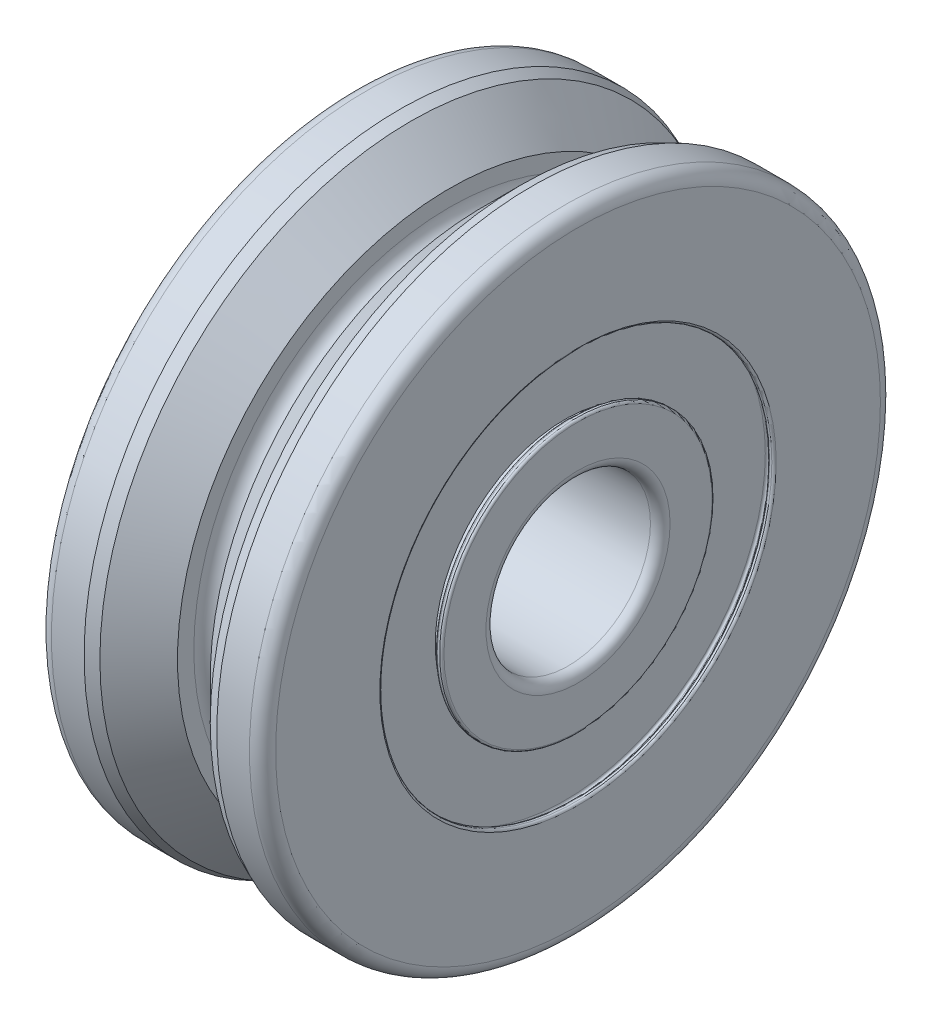
ISO-10303-21;
HEADER;
FILE_DESCRIPTION(('STEP AP214'),'2;1');
FILE_NAME('part.step','',(''),(''),'','','');
FILE_SCHEMA(('AUTOMOTIVE_DESIGN { 1 0 10303 214 1 1 1 1 }'));
ENDSEC;
DATA;
#1=APPLICATION_CONTEXT('core data for automotive mechanical design processes');
#2=APPLICATION_PROTOCOL_DEFINITION('international standard','automotive_design',2000,#1);
#3=PRODUCT_CONTEXT('',#1,'mechanical');
#4=PRODUCT('Part','Part','',(#3));
#5=PRODUCT_RELATED_PRODUCT_CATEGORY('part','',(#4));
#6=PRODUCT_DEFINITION_FORMATION('','',#4);
#7=PRODUCT_DEFINITION_CONTEXT('part definition',#1,'design');
#8=PRODUCT_DEFINITION('design','',#6,#7);
#9=PRODUCT_DEFINITION_SHAPE('','',#8);
#10=(LENGTH_UNIT() NAMED_UNIT(*) SI_UNIT(.MILLI.,.METRE.));
#11=(NAMED_UNIT(*) PLANE_ANGLE_UNIT() SI_UNIT($,.RADIAN.));
#12=(NAMED_UNIT(*) SI_UNIT($,.STERADIAN.) SOLID_ANGLE_UNIT());
#13=UNCERTAINTY_MEASURE_WITH_UNIT(LENGTH_MEASURE(1.E-05),#10,'distance_accuracy_value','');
#14=(GEOMETRIC_REPRESENTATION_CONTEXT(3) GLOBAL_UNCERTAINTY_ASSIGNED_CONTEXT((#13)) GLOBAL_UNIT_ASSIGNED_CONTEXT((#10,
#11,#12)) REPRESENTATION_CONTEXT('',''));
#15=CARTESIAN_POINT('',(0.,0.,0.));
#16=DIRECTION('',(0.,0.,1.));
#17=DIRECTION('',(1.,0.,0.));
#18=AXIS2_PLACEMENT_3D('',#15,#16,#17);
#19=CARTESIAN_POINT('',(-3.41206666624328,0.,0.));
#20=DIRECTION('',(1.,0.,0.));
#21=DIRECTION('',(0.,0.,-1.));
#22=AXIS2_PLACEMENT_3D('',#19,#20,#21);
#23=TOROIDAL_SURFACE('',#22,4.16136666582,0.0677333337567227);
#24=CARTESIAN_POINT('',(-3.4798,0.,0.));
#25=DIRECTION('',(1.,0.,0.));
#26=DIRECTION('',(0.,0.,-1.));
#27=AXIS2_PLACEMENT_3D('',#24,#25,#26);
#28=CIRCLE('',#27,4.16136666582);
#29=CARTESIAN_POINT('',(-3.4798,0.,-4.16136666582));
#30=VERTEX_POINT('',#29);
#31=EDGE_CURVE('E10',#30,#30,#28,.T.);
#32=ORIENTED_EDGE('',*,*,#31,.T.);
#33=EDGE_LOOP('',(#32));
#34=FACE_BOUND('',#33,.T.);
#35=CARTESIAN_POINT('',(-3.41206666624328,0.,0.));
#36=DIRECTION('',(1.,0.,0.));
#37=DIRECTION('',(0.,0.,-1.));
#38=AXIS2_PLACEMENT_3D('',#35,#36,#37);
#39=CIRCLE('',#38,4.22909999957672);
#40=CARTESIAN_POINT('',(-3.41206666624328,0.,-4.22909999957672));
#41=VERTEX_POINT('',#40);
#42=EDGE_CURVE('E164',#41,#41,#39,.T.);
#43=ORIENTED_EDGE('',*,*,#42,.F.);
#44=EDGE_LOOP('',(#43));
#45=FACE_BOUND('',#44,.T.);
#46=ADVANCED_FACE('F34',(#34,#45),#23,.T.);
#47=CARTESIAN_POINT('',(-3.47980000000005,4.16136666582,0.));
#48=DIRECTION('',(-1.,0.,0.));
#49=DIRECTION('',(0.,0.,1.));
#50=AXIS2_PLACEMENT_3D('',#47,#48,#49);
#51=PLANE('',#50);
#52=CARTESIAN_POINT('',(-3.4798000000001,0.,0.));
#53=DIRECTION('',(1.,0.,0.));
#54=DIRECTION('',(0.,0.,-1.));
#55=AXIS2_PLACEMENT_3D('',#52,#53,#54);
#56=CIRCLE('',#55,2.8575);
#57=CARTESIAN_POINT('',(-3.4798000000001,0.,-2.8575));
#58=VERTEX_POINT('',#57);
#59=EDGE_CURVE('E40',#58,#58,#56,.T.);
#60=ORIENTED_EDGE('',*,*,#59,.T.);
#61=EDGE_LOOP('',(#60));
#62=FACE_BOUND('',#61,.T.);
#63=ORIENTED_EDGE('',*,*,#31,.F.);
#64=EDGE_LOOP('',(#63));
#65=FACE_BOUND('',#64,.T.);
#66=ADVANCED_FACE('F172',(#62,#65),#51,.T.);
#67=CARTESIAN_POINT('',(-3.17500000000013,0.,0.));
#68=DIRECTION('',(1.,0.,0.));
#69=DIRECTION('',(0.,0.,-1.));
#70=AXIS2_PLACEMENT_3D('',#67,#68,#69);
#71=TOROIDAL_SURFACE('',#70,2.8575,0.304799999999968);
#72=CARTESIAN_POINT('',(-3.175,0.,0.));
#73=DIRECTION('',(1.,0.,0.));
#74=DIRECTION('',(0.,0.,-1.));
#75=AXIS2_PLACEMENT_3D('',#72,#73,#74);
#76=CIRCLE('',#75,2.5527);
#77=CARTESIAN_POINT('',(-3.175,0.,-2.5527));
#78=VERTEX_POINT('',#77);
#79=EDGE_CURVE('E44',#78,#78,#76,.T.);
#80=ORIENTED_EDGE('',*,*,#79,.T.);
#81=EDGE_LOOP('',(#80));
#82=FACE_BOUND('',#81,.T.);
#83=ORIENTED_EDGE('',*,*,#59,.F.);
#84=EDGE_LOOP('',(#83));
#85=FACE_BOUND('',#84,.T.);
#86=ADVANCED_FACE('F176',(#82,#85),#71,.T.);
#87=CARTESIAN_POINT('',(-3.47980000084656,0.,0.));
#88=DIRECTION('',(1.,0.,0.));
#89=DIRECTION('',(0.,0.,-1.));
#90=AXIS2_PLACEMENT_3D('',#87,#88,#89);
#91=CYLINDRICAL_SURFACE('',#90,2.55270000000003);
#92=CARTESIAN_POINT('',(3.175,0.,0.));
#93=DIRECTION('',(1.,0.,0.));
#94=DIRECTION('',(0.,0.,-1.));
#95=AXIS2_PLACEMENT_3D('',#92,#93,#94);
#96=CIRCLE('',#95,2.55270000000006);
#97=CARTESIAN_POINT('',(3.175,0.,-2.55270000000006));
#98=VERTEX_POINT('',#97);
#99=EDGE_CURVE('E48',#98,#98,#96,.T.);
#100=ORIENTED_EDGE('',*,*,#99,.T.);
#101=EDGE_LOOP('',(#100));
#102=FACE_BOUND('',#101,.T.);
#103=ORIENTED_EDGE('',*,*,#79,.F.);
#104=EDGE_LOOP('',(#103));
#105=FACE_BOUND('',#104,.T.);
#106=ADVANCED_FACE('F180',(#102,#105),#91,.F.);
#107=CARTESIAN_POINT('',(3.17500000000013,0.,0.));
#108=DIRECTION('',(1.,0.,0.));
#109=DIRECTION('',(0.,0.,-1.));
#110=AXIS2_PLACEMENT_3D('',#107,#108,#109);
#111=TOROIDAL_SURFACE('',#110,2.8575,0.304799999999937);
#112=CARTESIAN_POINT('',(3.4798,0.,0.));
#113=DIRECTION('',(1.,0.,0.));
#114=DIRECTION('',(0.,0.,-1.));
#115=AXIS2_PLACEMENT_3D('',#112,#113,#114);
#116=CIRCLE('',#115,2.8575);
#117=CARTESIAN_POINT('',(3.4798,0.,-2.8575));
#118=VERTEX_POINT('',#117);
#119=EDGE_CURVE('E53',#118,#118,#116,.T.);
#120=ORIENTED_EDGE('',*,*,#119,.T.);
#121=EDGE_LOOP('',(#120));
#122=FACE_BOUND('',#121,.T.);
#123=ORIENTED_EDGE('',*,*,#99,.F.);
#124=EDGE_LOOP('',(#123));
#125=FACE_BOUND('',#124,.T.);
#126=ADVANCED_FACE('F187',(#122,#125),#111,.T.);
#127=CARTESIAN_POINT('',(3.47979999999998,2.8575,0.));
#128=DIRECTION('',(1.,0.,0.));
#129=DIRECTION('',(0.,0.,-1.));
#130=AXIS2_PLACEMENT_3D('',#127,#128,#129);
#131=PLANE('',#130);
#132=CARTESIAN_POINT('',(3.47979999999996,0.,0.));
#133=DIRECTION('',(1.,0.,0.));
#134=DIRECTION('',(0.,0.,-1.));
#135=AXIS2_PLACEMENT_3D('',#132,#133,#134);
#136=CIRCLE('',#135,4.16136666560836);
#137=CARTESIAN_POINT('',(3.47979999999996,0.,-4.16136666560836));
#138=VERTEX_POINT('',#137);
#139=EDGE_CURVE('E56',#138,#138,#136,.T.);
#140=ORIENTED_EDGE('',*,*,#139,.T.);
#141=EDGE_LOOP('',(#140));
#142=FACE_BOUND('',#141,.T.);
#143=ORIENTED_EDGE('',*,*,#119,.F.);
#144=EDGE_LOOP('',(#143));
#145=FACE_BOUND('',#144,.T.);
#146=ADVANCED_FACE('F191',(#142,#145),#131,.T.);
#147=CARTESIAN_POINT('',(3.4120666660316,0.,0.));
#148=DIRECTION('',(1.,0.,0.));
#149=DIRECTION('',(0.,0.,-1.));
#150=AXIS2_PLACEMENT_3D('',#147,#148,#149);
#151=TOROIDAL_SURFACE('',#150,4.16136666560836,0.0677333339683614);
#152=CARTESIAN_POINT('',(3.4120666660316,0.,0.));
#153=DIRECTION('',(1.,0.,0.));
#154=DIRECTION('',(0.,0.,-1.));
#155=AXIS2_PLACEMENT_3D('',#152,#153,#154);
#156=CIRCLE('',#155,4.22909999957672);
#157=CARTESIAN_POINT('',(3.4120666660316,0.,-4.22909999957672));
#158=VERTEX_POINT('',#157);
#159=EDGE_CURVE('E59',#158,#158,#156,.T.);
#160=ORIENTED_EDGE('',*,*,#159,.T.);
#161=EDGE_LOOP('',(#160));
#162=FACE_BOUND('',#161,.T.);
#163=ORIENTED_EDGE('',*,*,#139,.F.);
#164=EDGE_LOOP('',(#163));
#165=FACE_BOUND('',#164,.T.);
#166=ADVANCED_FACE('F195',(#162,#165),#151,.T.);
#167=CARTESIAN_POINT('',(-3.47980000084656,0.,0.));
#168=DIRECTION('',(1.,0.,0.));
#169=DIRECTION('',(0.,0.,-1.));
#170=AXIS2_PLACEMENT_3D('',#167,#168,#169);
#171=CYLINDRICAL_SURFACE('',#170,4.22909999957672);
#172=CARTESIAN_POINT('',(3.34433333375672,0.,0.));
#173=DIRECTION('',(1.,0.,0.));
#174=DIRECTION('',(0.,0.,-1.));
#175=AXIS2_PLACEMENT_3D('',#172,#173,#174);
#176=CIRCLE('',#175,4.22909999957672);
#177=CARTESIAN_POINT('',(3.34433333375672,0.,-4.22909999957672));
#178=VERTEX_POINT('',#177);
#179=EDGE_CURVE('E62',#178,#178,#176,.T.);
#180=ORIENTED_EDGE('',*,*,#179,.T.);
#181=EDGE_LOOP('',(#180));
#182=FACE_BOUND('',#181,.T.);
#183=ORIENTED_EDGE('',*,*,#159,.F.);
#184=EDGE_LOOP('',(#183));
#185=FACE_BOUND('',#184,.T.);
#186=ADVANCED_FACE('F199',(#182,#185),#171,.T.);
#187=CARTESIAN_POINT('',(3.34433333375672,0.,0.));
#188=DIRECTION('',(1.,0.,0.));
#189=DIRECTION('',(0.,0.,-1.));
#190=AXIS2_PLACEMENT_3D('',#187,#188,#189);
#191=TOROIDAL_SURFACE('',#190,4.16136666582,0.0677333337567223);
#192=CARTESIAN_POINT('',(3.2766,0.,0.));
#193=DIRECTION('',(1.,0.,0.));
#194=DIRECTION('',(0.,0.,-1.));
#195=AXIS2_PLACEMENT_3D('',#192,#193,#194);
#196=CIRCLE('',#195,4.16136666582);
#197=CARTESIAN_POINT('',(3.2766,0.,-4.16136666582));
#198=VERTEX_POINT('',#197);
#199=EDGE_CURVE('E65',#198,#198,#196,.T.);
#200=ORIENTED_EDGE('',*,*,#199,.T.);
#201=EDGE_LOOP('',(#200));
#202=FACE_BOUND('',#201,.T.);
#203=ORIENTED_EDGE('',*,*,#179,.F.);
#204=EDGE_LOOP('',(#203));
#205=FACE_BOUND('',#204,.T.);
#206=ADVANCED_FACE('F203',(#202,#205),#191,.T.);
#207=CARTESIAN_POINT('',(3.2766,4.16136666582,0.));
#208=DIRECTION('',(-1.,0.,0.));
#209=DIRECTION('',(0.,0.,1.));
#210=AXIS2_PLACEMENT_3D('',#207,#208,#209);
#211=PLANE('',#210);
#212=CARTESIAN_POINT('',(3.2766,0.,0.));
#213=DIRECTION('',(1.,0.,0.));
#214=DIRECTION('',(0.,0.,-1.));
#215=AXIS2_PLACEMENT_3D('',#212,#213,#214);
#216=CIRCLE('',#215,4.02589999978836);
#217=CARTESIAN_POINT('',(3.2766,0.,-4.02589999978836));
#218=VERTEX_POINT('',#217);
#219=EDGE_CURVE('E68',#218,#218,#216,.T.);
#220=ORIENTED_EDGE('',*,*,#219,.T.);
#221=EDGE_LOOP('',(#220));
#222=FACE_BOUND('',#221,.T.);
#223=ORIENTED_EDGE('',*,*,#199,.F.);
#224=EDGE_LOOP('',(#223));
#225=FACE_BOUND('',#224,.T.);
#226=ADVANCED_FACE('F207',(#222,#225),#211,.T.);
#227=CARTESIAN_POINT('',(-3.47980000084656,0.,0.));
#228=DIRECTION('',(1.,0.,0.));
#229=DIRECTION('',(0.,0.,-1.));
#230=AXIS2_PLACEMENT_3D('',#227,#228,#229);
#231=CYLINDRICAL_SURFACE('',#230,4.02589999978836);
#232=CARTESIAN_POINT('',(3.07340000042328,0.,0.));
#233=DIRECTION('',(1.,0.,0.));
#234=DIRECTION('',(0.,0.,-1.));
#235=AXIS2_PLACEMENT_3D('',#232,#233,#234);
#236=CIRCLE('',#235,4.02589999978836);
#237=CARTESIAN_POINT('',(3.07340000042328,0.,-4.02589999978836));
#238=VERTEX_POINT('',#237);
#239=EDGE_CURVE('E71',#238,#238,#236,.T.);
#240=ORIENTED_EDGE('',*,*,#239,.T.);
#241=EDGE_LOOP('',(#240));
#242=FACE_BOUND('',#241,.T.);
#243=ORIENTED_EDGE('',*,*,#219,.F.);
#244=EDGE_LOOP('',(#243));
#245=FACE_BOUND('',#244,.T.);
#246=ADVANCED_FACE('F211',(#242,#245),#231,.T.);
#247=CARTESIAN_POINT('',(3.07340000042328,4.02589999978836,0.));
#248=DIRECTION('',(1.,0.,0.));
#249=DIRECTION('',(0.,0.,-1.));
#250=AXIS2_PLACEMENT_3D('',#247,#248,#249);
#251=PLANE('',#250);
#252=CARTESIAN_POINT('',(3.07340000042328,0.,0.));
#253=DIRECTION('',(1.,0.,0.));
#254=DIRECTION('',(0.,0.,-1.));
#255=AXIS2_PLACEMENT_3D('',#252,#253,#254);
#256=CIRCLE('',#255,6.21876666582);
#257=CARTESIAN_POINT('',(3.07340000042328,0.,-6.21876666582));
#258=VERTEX_POINT('',#257);
#259=EDGE_CURVE('E74',#258,#258,#256,.T.);
#260=ORIENTED_EDGE('',*,*,#259,.T.);
#261=EDGE_LOOP('',(#260));
#262=FACE_BOUND('',#261,.T.);
#263=ORIENTED_EDGE('',*,*,#239,.F.);
#264=EDGE_LOOP('',(#263));
#265=FACE_BOUND('',#264,.T.);
#266=ADVANCED_FACE('F215',(#262,#265),#251,.T.);
#267=CARTESIAN_POINT('',(3.14113333439164,0.,0.));
#268=DIRECTION('',(1.,0.,0.));
#269=DIRECTION('',(0.,0.,-1.));
#270=AXIS2_PLACEMENT_3D('',#267,#268,#269);
#271=TOROIDAL_SURFACE('',#270,6.21876666582,0.0677333339683603);
#272=CARTESIAN_POINT('',(3.14113333439164,0.,0.));
#273=DIRECTION('',(1.,0.,0.));
#274=DIRECTION('',(0.,0.,-1.));
#275=AXIS2_PLACEMENT_3D('',#272,#273,#274);
#276=CIRCLE('',#275,6.28649999978836);
#277=CARTESIAN_POINT('',(3.14113333439164,0.,-6.28649999978836));
#278=VERTEX_POINT('',#277);
#279=EDGE_CURVE('E77',#278,#278,#276,.T.);
#280=ORIENTED_EDGE('',*,*,#279,.T.);
#281=EDGE_LOOP('',(#280));
#282=FACE_BOUND('',#281,.T.);
#283=ORIENTED_EDGE('',*,*,#259,.F.);
#284=EDGE_LOOP('',(#283));
#285=FACE_BOUND('',#284,.T.);
#286=ADVANCED_FACE('F219',(#282,#285),#271,.F.);
#287=CARTESIAN_POINT('',(-3.47980000084656,0.,0.));
#288=DIRECTION('',(1.,0.,0.));
#289=DIRECTION('',(0.,0.,-1.));
#290=AXIS2_PLACEMENT_3D('',#287,#288,#289);
#291=CYLINDRICAL_SURFACE('',#290,6.28649999978836);
#292=CARTESIAN_POINT('',(3.2766,0.,0.));
#293=DIRECTION('',(1.,0.,0.));
#294=DIRECTION('',(0.,0.,-1.));
#295=AXIS2_PLACEMENT_3D('',#292,#293,#294);
#296=CIRCLE('',#295,6.28649999978836);
#297=CARTESIAN_POINT('',(3.2766,0.,-6.28649999978836));
#298=VERTEX_POINT('',#297);
#299=EDGE_CURVE('E80',#298,#298,#296,.T.);
#300=ORIENTED_EDGE('',*,*,#299,.T.);
#301=EDGE_LOOP('',(#300));
#302=FACE_BOUND('',#301,.T.);
#303=ORIENTED_EDGE('',*,*,#279,.F.);
#304=EDGE_LOOP('',(#303));
#305=FACE_BOUND('',#304,.T.);
#306=ADVANCED_FACE('F223',(#302,#305),#291,.F.);
#307=CARTESIAN_POINT('',(3.2766,6.28649999978836,0.));
#308=DIRECTION('',(-1.,0.,0.));
#309=DIRECTION('',(0.,0.,1.));
#310=AXIS2_PLACEMENT_3D('',#307,#308,#309);
#311=PLANE('',#310);
#312=CARTESIAN_POINT('',(3.2766,0.,0.));
#313=DIRECTION('',(1.,0.,0.));
#314=DIRECTION('',(0.,0.,-1.));
#315=AXIS2_PLACEMENT_3D('',#312,#313,#314);
#316=CIRCLE('',#315,6.15103333418);
#317=CARTESIAN_POINT('',(3.2766,0.,-6.15103333418));
#318=VERTEX_POINT('',#317);
#319=EDGE_CURVE('E83',#318,#318,#316,.T.);
#320=ORIENTED_EDGE('',*,*,#319,.T.);
#321=EDGE_LOOP('',(#320));
#322=FACE_BOUND('',#321,.T.);
#323=ORIENTED_EDGE('',*,*,#299,.F.);
#324=EDGE_LOOP('',(#323));
#325=FACE_BOUND('',#324,.T.);
#326=ADVANCED_FACE('F227',(#322,#325),#311,.T.);
#327=CARTESIAN_POINT('',(3.34433333396836,0.,0.));
#328=DIRECTION('',(1.,0.,0.));
#329=DIRECTION('',(0.,0.,-1.));
#330=AXIS2_PLACEMENT_3D('',#327,#328,#329);
#331=TOROIDAL_SURFACE('',#330,6.15103333418,0.0677333339683614);
#332=CARTESIAN_POINT('',(3.34433333396836,0.,0.));
#333=DIRECTION('',(1.,0.,0.));
#334=DIRECTION('',(0.,0.,-1.));
#335=AXIS2_PLACEMENT_3D('',#332,#333,#334);
#336=CIRCLE('',#335,6.08330000021164);
#337=CARTESIAN_POINT('',(3.34433333396836,0.,-6.08330000021164));
#338=VERTEX_POINT('',#337);
#339=EDGE_CURVE('E86',#338,#338,#336,.T.);
#340=ORIENTED_EDGE('',*,*,#339,.T.);
#341=EDGE_LOOP('',(#340));
#342=FACE_BOUND('',#341,.T.);
#343=ORIENTED_EDGE('',*,*,#319,.F.);
#344=EDGE_LOOP('',(#343));
#345=FACE_BOUND('',#344,.T.);
#346=ADVANCED_FACE('F231',(#342,#345),#331,.T.);
#347=CARTESIAN_POINT('',(-3.47980000084656,0.,0.));
#348=DIRECTION('',(1.,0.,0.));
#349=DIRECTION('',(0.,0.,-1.));
#350=AXIS2_PLACEMENT_3D('',#347,#348,#349);
#351=CYLINDRICAL_SURFACE('',#350,6.08330000021164);
#352=CARTESIAN_POINT('',(3.41206666624324,0.,0.));
#353=DIRECTION('',(1.,0.,0.));
#354=DIRECTION('',(0.,0.,-1.));
#355=AXIS2_PLACEMENT_3D('',#352,#353,#354);
#356=CIRCLE('',#355,6.08330000021164);
#357=CARTESIAN_POINT('',(3.41206666624324,0.,-6.08330000021164));
#358=VERTEX_POINT('',#357);
#359=EDGE_CURVE('E89',#358,#358,#356,.T.);
#360=ORIENTED_EDGE('',*,*,#359,.T.);
#361=EDGE_LOOP('',(#360));
#362=FACE_BOUND('',#361,.T.);
#363=ORIENTED_EDGE('',*,*,#339,.F.);
#364=EDGE_LOOP('',(#363));
#365=FACE_BOUND('',#364,.T.);
#366=ADVANCED_FACE('F235',(#362,#365),#351,.F.);
#367=CARTESIAN_POINT('',(3.41206666624324,0.,0.));
#368=DIRECTION('',(1.,0.,0.));
#369=DIRECTION('',(0.,0.,-1.));
#370=AXIS2_PLACEMENT_3D('',#367,#368,#369);
#371=TOROIDAL_SURFACE('',#370,6.15103333396836,0.0677333337567212);
#372=CARTESIAN_POINT('',(3.47979999999996,0.,0.));
#373=DIRECTION('',(1.,0.,0.));
#374=DIRECTION('',(0.,0.,-1.));
#375=AXIS2_PLACEMENT_3D('',#372,#373,#374);
#376=CIRCLE('',#375,6.15103333396836);
#377=CARTESIAN_POINT('',(3.47979999999996,0.,-6.15103333396836));
#378=VERTEX_POINT('',#377);
#379=EDGE_CURVE('E92',#378,#378,#376,.T.);
#380=ORIENTED_EDGE('',*,*,#379,.T.);
#381=EDGE_LOOP('',(#380));
#382=FACE_BOUND('',#381,.T.);
#383=ORIENTED_EDGE('',*,*,#359,.F.);
#384=EDGE_LOOP('',(#383));
#385=FACE_BOUND('',#384,.T.);
#386=ADVANCED_FACE('F239',(#382,#385),#371,.T.);
#387=CARTESIAN_POINT('',(3.47979999999996,6.15103333396836,0.));
#388=DIRECTION('',(1.,0.,0.));
#389=DIRECTION('',(0.,0.,-1.));
#390=AXIS2_PLACEMENT_3D('',#387,#388,#389);
#391=PLANE('',#390);
#392=CARTESIAN_POINT('',(3.47979999999996,0.,0.));
#393=DIRECTION('',(1.,0.,0.));
#394=DIRECTION('',(0.,0.,-1.));
#395=AXIS2_PLACEMENT_3D('',#392,#393,#394);
#396=CIRCLE('',#395,9.3853);
#397=CARTESIAN_POINT('',(3.47979999999996,0.,-9.3853));
#398=VERTEX_POINT('',#397);
#399=EDGE_CURVE('E95',#398,#398,#396,.T.);
#400=ORIENTED_EDGE('',*,*,#399,.T.);
#401=EDGE_LOOP('',(#400));
#402=FACE_BOUND('',#401,.T.);
#403=ORIENTED_EDGE('',*,*,#379,.F.);
#404=EDGE_LOOP('',(#403));
#405=FACE_BOUND('',#404,.T.);
#406=ADVANCED_FACE('F243',(#402,#405),#391,.T.);
#407=CARTESIAN_POINT('',(3.07339999999995,0.,0.));
#408=DIRECTION('',(1.,0.,0.));
#409=DIRECTION('',(0.,0.,-1.));
#410=AXIS2_PLACEMENT_3D('',#407,#408,#409);
#411=TOROIDAL_SURFACE('',#410,9.3853,0.406400000000013);
#412=CARTESIAN_POINT('',(3.0734,0.,0.));
#413=DIRECTION('',(1.,0.,0.));
#414=DIRECTION('',(0.,0.,-1.));
#415=AXIS2_PLACEMENT_3D('',#412,#413,#414);
#416=CIRCLE('',#415,9.7917);
#417=CARTESIAN_POINT('',(3.0734,0.,-9.7917));
#418=VERTEX_POINT('',#417);
#419=EDGE_CURVE('E98',#418,#418,#416,.T.);
#420=ORIENTED_EDGE('',*,*,#419,.T.);
#421=EDGE_LOOP('',(#420));
#422=FACE_BOUND('',#421,.T.);
#423=ORIENTED_EDGE('',*,*,#399,.F.);
#424=EDGE_LOOP('',(#423));
#425=FACE_BOUND('',#424,.T.);
#426=ADVANCED_FACE('F247',(#422,#425),#411,.T.);
#427=CARTESIAN_POINT('',(-3.47980000084656,0.,0.));
#428=DIRECTION('',(1.,0.,0.));
#429=DIRECTION('',(0.,0.,-1.));
#430=AXIS2_PLACEMENT_3D('',#427,#428,#429);
#431=CYLINDRICAL_SURFACE('',#430,9.7917);
#432=CARTESIAN_POINT('',(2.0593460483126,0.,0.));
#433=DIRECTION('',(1.,0.,0.));
#434=DIRECTION('',(0.,0.,-1.));
#435=AXIS2_PLACEMENT_3D('',#432,#433,#434);
#436=CIRCLE('',#435,9.7917);
#437=CARTESIAN_POINT('',(2.0593460483126,0.,-9.7917));
#438=VERTEX_POINT('',#437);
#439=EDGE_CURVE('E101',#438,#438,#436,.T.);
#440=ORIENTED_EDGE('',*,*,#439,.T.);
#441=EDGE_LOOP('',(#440));
#442=FACE_BOUND('',#441,.T.);
#443=ORIENTED_EDGE('',*,*,#419,.F.);
#444=EDGE_LOOP('',(#443));
#445=FACE_BOUND('',#444,.T.);
#446=ADVANCED_FACE('F251',(#442,#445),#431,.T.);
#447=CARTESIAN_POINT('',(2.0593460483126,0.,0.));
#448=DIRECTION('',(1.,0.,0.));
#449=DIRECTION('',(0.,0.,-1.));
#450=AXIS2_PLACEMENT_3D('',#447,#448,#449);
#451=CONICAL_SURFACE('',#450,9.7917,0.392699078605462);
#452=CARTESIAN_POINT('',(1.7124619503755,0.,0.));
#453=DIRECTION('',(1.,0.,0.));
#454=DIRECTION('',(0.,0.,-1.));
#455=AXIS2_PLACEMENT_3D('',#452,#453,#454);
#456=CIRCLE('',#455,9.64801590332);
#457=CARTESIAN_POINT('',(1.7124619503755,0.,-9.64801590332));
#458=VERTEX_POINT('',#457);
#459=EDGE_CURVE('E104',#458,#458,#456,.T.);
#460=ORIENTED_EDGE('',*,*,#459,.T.);
#461=EDGE_LOOP('',(#460));
#462=FACE_BOUND('',#461,.T.);
#463=ORIENTED_EDGE('',*,*,#439,.F.);
#464=EDGE_LOOP('',(#463));
#465=FACE_BOUND('',#464,.T.);
#466=ADVANCED_FACE('F255',(#462,#465),#451,.T.);
#467=CARTESIAN_POINT('',(1.7124619503755,0.,0.));
#468=DIRECTION('',(1.,0.,0.));
#469=DIRECTION('',(0.,0.,-1.));
#470=AXIS2_PLACEMENT_3D('',#467,#468,#469);
#471=CONICAL_SURFACE('',#470,9.64801590332,0.785398163397434);
#472=CARTESIAN_POINT('',(0.507999999057733,0.,0.));
#473=DIRECTION('',(1.,0.,0.));
#474=DIRECTION('',(0.,0.,-1.));
#475=AXIS2_PLACEMENT_3D('',#472,#473,#474);
#476=CIRCLE('',#475,8.44355395200227);
#477=CARTESIAN_POINT('',(0.507999999057733,0.,-8.44355395200227));
#478=VERTEX_POINT('',#477);
#479=EDGE_CURVE('E107',#478,#478,#476,.T.);
#480=ORIENTED_EDGE('',*,*,#479,.T.);
#481=EDGE_LOOP('',(#480));
#482=FACE_BOUND('',#481,.T.);
#483=ORIENTED_EDGE('',*,*,#459,.F.);
#484=EDGE_LOOP('',(#483));
#485=FACE_BOUND('',#484,.T.);
#486=ADVANCED_FACE('F259',(#482,#485),#471,.T.);
#487=CARTESIAN_POINT('',(0.507999999057733,8.44355395200227,0.));
#488=DIRECTION('',(-1.,0.,0.));
#489=DIRECTION('',(0.,0.,1.));
#490=AXIS2_PLACEMENT_3D('',#487,#488,#489);
#491=PLANE('',#490);
#492=CARTESIAN_POINT('',(0.507999999057733,0.,0.));
#493=DIRECTION('',(1.,0.,0.));
#494=DIRECTION('',(0.,0.,-1.));
#495=AXIS2_PLACEMENT_3D('',#492,#493,#494);
#496=CIRCLE('',#495,7.93750000094227);
#497=CARTESIAN_POINT('',(0.507999999057733,0.,-7.93750000094227));
#498=VERTEX_POINT('',#497);
#499=EDGE_CURVE('E110',#498,#498,#496,.T.);
#500=ORIENTED_EDGE('',*,*,#499,.T.);
#501=EDGE_LOOP('',(#500));
#502=FACE_BOUND('',#501,.T.);
#503=ORIENTED_EDGE('',*,*,#479,.F.);
#504=EDGE_LOOP('',(#503));
#505=FACE_BOUND('',#504,.T.);
#506=ADVANCED_FACE('F263',(#502,#505),#491,.T.);
#507=CARTESIAN_POINT('',(0.,0.,0.));
#508=DIRECTION('',(1.,0.,0.));
#509=DIRECTION('',(0.,0.,-1.));
#510=AXIS2_PLACEMENT_3D('',#507,#508,#509);
#511=TOROIDAL_SURFACE('',#510,7.93750000094227,0.507999999057733);
#512=CARTESIAN_POINT('',(-0.507999999057733,0.,0.));
#513=DIRECTION('',(1.,0.,0.));
#514=DIRECTION('',(0.,0.,-1.));
#515=AXIS2_PLACEMENT_3D('',#512,#513,#514);
#516=CIRCLE('',#515,7.93750000094227);
#517=CARTESIAN_POINT('',(-0.507999999057733,0.,-7.93750000094227));
#518=VERTEX_POINT('',#517);
#519=EDGE_CURVE('E113',#518,#518,#516,.T.);
#520=ORIENTED_EDGE('',*,*,#519,.T.);
#521=EDGE_LOOP('',(#520));
#522=FACE_BOUND('',#521,.T.);
#523=ORIENTED_EDGE('',*,*,#499,.F.);
#524=EDGE_LOOP('',(#523));
#525=FACE_BOUND('',#524,.T.);
#526=ADVANCED_FACE('F267',(#522,#525),#511,.F.);
#527=CARTESIAN_POINT('',(-0.507999999057733,7.93750000094227,0.));
#528=DIRECTION('',(1.,0.,0.));
#529=DIRECTION('',(0.,0.,-1.));
#530=AXIS2_PLACEMENT_3D('',#527,#528,#529);
#531=PLANE('',#530);
#532=CARTESIAN_POINT('',(-0.507999999057733,0.,0.));
#533=DIRECTION('',(1.,0.,0.));
#534=DIRECTION('',(0.,0.,-1.));
#535=AXIS2_PLACEMENT_3D('',#532,#533,#534);
#536=CIRCLE('',#535,8.44355395200226);
#537=CARTESIAN_POINT('',(-0.507999999057733,0.,-8.44355395200226));
#538=VERTEX_POINT('',#537);
#539=EDGE_CURVE('E116',#538,#538,#536,.T.);
#540=ORIENTED_EDGE('',*,*,#539,.T.);
#541=EDGE_LOOP('',(#540));
#542=FACE_BOUND('',#541,.T.);
#543=ORIENTED_EDGE('',*,*,#519,.F.);
#544=EDGE_LOOP('',(#543));
#545=FACE_BOUND('',#544,.T.);
#546=ADVANCED_FACE('F271',(#542,#545),#531,.T.);
#547=CARTESIAN_POINT('',(-0.507999999057733,0.,0.));
#548=DIRECTION('',(-1.,0.,0.));
#549=DIRECTION('',(0.,0.,1.));
#550=AXIS2_PLACEMENT_3D('',#547,#548,#549);
#551=CONICAL_SURFACE('',#550,8.44355395200226,0.785398163397435);
#552=CARTESIAN_POINT('',(-1.7124619503755,0.,0.));
#553=DIRECTION('',(1.,0.,0.));
#554=DIRECTION('',(0.,0.,-1.));
#555=AXIS2_PLACEMENT_3D('',#552,#553,#554);
#556=CIRCLE('',#555,9.64801590332);
#557=CARTESIAN_POINT('',(-1.7124619503755,0.,-9.64801590332));
#558=VERTEX_POINT('',#557);
#559=EDGE_CURVE('E119',#558,#558,#556,.T.);
#560=ORIENTED_EDGE('',*,*,#559,.T.);
#561=EDGE_LOOP('',(#560));
#562=FACE_BOUND('',#561,.T.);
#563=ORIENTED_EDGE('',*,*,#539,.F.);
#564=EDGE_LOOP('',(#563));
#565=FACE_BOUND('',#564,.T.);
#566=ADVANCED_FACE('F275',(#562,#565),#551,.T.);
#567=CARTESIAN_POINT('',(-1.7124619503755,0.,0.));
#568=DIRECTION('',(-1.,0.,0.));
#569=DIRECTION('',(0.,0.,1.));
#570=AXIS2_PLACEMENT_3D('',#567,#568,#569);
#571=CONICAL_SURFACE('',#570,9.64801590332,0.392699078605462);
#572=CARTESIAN_POINT('',(-2.0593460483126,0.,0.));
#573=DIRECTION('',(1.,0.,0.));
#574=DIRECTION('',(0.,0.,-1.));
#575=AXIS2_PLACEMENT_3D('',#572,#573,#574);
#576=CIRCLE('',#575,9.7917);
#577=CARTESIAN_POINT('',(-2.0593460483126,0.,-9.7917));
#578=VERTEX_POINT('',#577);
#579=EDGE_CURVE('E122',#578,#578,#576,.T.);
#580=ORIENTED_EDGE('',*,*,#579,.T.);
#581=EDGE_LOOP('',(#580));
#582=FACE_BOUND('',#581,.T.);
#583=ORIENTED_EDGE('',*,*,#559,.F.);
#584=EDGE_LOOP('',(#583));
#585=FACE_BOUND('',#584,.T.);
#586=ADVANCED_FACE('F279',(#582,#585),#571,.T.);
#587=CARTESIAN_POINT('',(-3.47980000084656,0.,0.));
#588=DIRECTION('',(1.,0.,0.));
#589=DIRECTION('',(0.,0.,-1.));
#590=AXIS2_PLACEMENT_3D('',#587,#588,#589);
#591=CYLINDRICAL_SURFACE('',#590,9.79170000000001);
#592=CARTESIAN_POINT('',(-3.0734,0.,0.));
#593=DIRECTION('',(1.,0.,0.));
#594=DIRECTION('',(0.,0.,-1.));
#595=AXIS2_PLACEMENT_3D('',#592,#593,#594);
#596=CIRCLE('',#595,9.79170000000003);
#597=CARTESIAN_POINT('',(-3.0734,0.,-9.79170000000003));
#598=VERTEX_POINT('',#597);
#599=EDGE_CURVE('E125',#598,#598,#596,.T.);
#600=ORIENTED_EDGE('',*,*,#599,.T.);
#601=EDGE_LOOP('',(#600));
#602=FACE_BOUND('',#601,.T.);
#603=ORIENTED_EDGE('',*,*,#579,.F.);
#604=EDGE_LOOP('',(#603));
#605=FACE_BOUND('',#604,.T.);
#606=ADVANCED_FACE('F283',(#602,#605),#591,.T.);
#607=CARTESIAN_POINT('',(-3.07339999999995,0.,0.));
#608=DIRECTION('',(1.,0.,0.));
#609=DIRECTION('',(0.,0.,-1.));
#610=AXIS2_PLACEMENT_3D('',#607,#608,#609);
#611=TOROIDAL_SURFACE('',#610,9.3853,0.406400000000026);
#612=CARTESIAN_POINT('',(-3.4798,0.,0.));
#613=DIRECTION('',(1.,0.,0.));
#614=DIRECTION('',(0.,0.,-1.));
#615=AXIS2_PLACEMENT_3D('',#612,#613,#614);
#616=CIRCLE('',#615,9.3853);
#617=CARTESIAN_POINT('',(-3.4798,0.,-9.3853));
#618=VERTEX_POINT('',#617);
#619=EDGE_CURVE('E128',#618,#618,#616,.T.);
#620=ORIENTED_EDGE('',*,*,#619,.T.);
#621=EDGE_LOOP('',(#620));
#622=FACE_BOUND('',#621,.T.);
#623=ORIENTED_EDGE('',*,*,#599,.F.);
#624=EDGE_LOOP('',(#623));
#625=FACE_BOUND('',#624,.T.);
#626=ADVANCED_FACE('F287',(#622,#625),#611,.T.);
#627=CARTESIAN_POINT('',(-3.4798,9.3853,0.));
#628=DIRECTION('',(-1.,0.,0.));
#629=DIRECTION('',(0.,0.,1.));
#630=AXIS2_PLACEMENT_3D('',#627,#628,#629);
#631=PLANE('',#630);
#632=CARTESIAN_POINT('',(-3.4798,0.,0.));
#633=DIRECTION('',(1.,0.,0.));
#634=DIRECTION('',(0.,0.,-1.));
#635=AXIS2_PLACEMENT_3D('',#632,#633,#634);
#636=CIRCLE('',#635,6.15103333418);
#637=CARTESIAN_POINT('',(-3.4798,0.,-6.15103333418));
#638=VERTEX_POINT('',#637);
#639=EDGE_CURVE('E131',#638,#638,#636,.T.);
#640=ORIENTED_EDGE('',*,*,#639,.T.);
#641=EDGE_LOOP('',(#640));
#642=FACE_BOUND('',#641,.T.);
#643=ORIENTED_EDGE('',*,*,#619,.F.);
#644=EDGE_LOOP('',(#643));
#645=FACE_BOUND('',#644,.T.);
#646=ADVANCED_FACE('F291',(#642,#645),#631,.T.);
#647=CARTESIAN_POINT('',(-3.41206666603164,0.,0.));
#648=DIRECTION('',(1.,0.,0.));
#649=DIRECTION('',(0.,0.,-1.));
#650=AXIS2_PLACEMENT_3D('',#647,#648,#649);
#651=TOROIDAL_SURFACE('',#650,6.15103333418,0.0677333339683611);
#652=CARTESIAN_POINT('',(-3.41206666603164,0.,0.));
#653=DIRECTION('',(1.,0.,0.));
#654=DIRECTION('',(0.,0.,-1.));
#655=AXIS2_PLACEMENT_3D('',#652,#653,#654);
#656=CIRCLE('',#655,6.08330000021164);
#657=CARTESIAN_POINT('',(-3.41206666603164,0.,-6.08330000021164));
#658=VERTEX_POINT('',#657);
#659=EDGE_CURVE('E134',#658,#658,#656,.T.);
#660=ORIENTED_EDGE('',*,*,#659,.T.);
#661=EDGE_LOOP('',(#660));
#662=FACE_BOUND('',#661,.T.);
#663=ORIENTED_EDGE('',*,*,#639,.F.);
#664=EDGE_LOOP('',(#663));
#665=FACE_BOUND('',#664,.T.);
#666=ADVANCED_FACE('F295',(#662,#665),#651,.T.);
#667=CARTESIAN_POINT('',(-3.47980000084656,0.,0.));
#668=DIRECTION('',(1.,0.,0.));
#669=DIRECTION('',(0.,0.,-1.));
#670=AXIS2_PLACEMENT_3D('',#667,#668,#669);
#671=CYLINDRICAL_SURFACE('',#670,6.08330000021164);
#672=CARTESIAN_POINT('',(-3.34433333269852,0.,0.));
#673=DIRECTION('',(1.,0.,0.));
#674=DIRECTION('',(0.,0.,-1.));
#675=AXIS2_PLACEMENT_3D('',#672,#673,#674);
#676=CIRCLE('',#675,6.08330000021164);
#677=CARTESIAN_POINT('',(-3.34433333269852,0.,-6.08330000021164));
#678=VERTEX_POINT('',#677);
#679=EDGE_CURVE('E137',#678,#678,#676,.T.);
#680=ORIENTED_EDGE('',*,*,#679,.T.);
#681=EDGE_LOOP('',(#680));
#682=FACE_BOUND('',#681,.T.);
#683=ORIENTED_EDGE('',*,*,#659,.F.);
#684=EDGE_LOOP('',(#683));
#685=FACE_BOUND('',#684,.T.);
#686=ADVANCED_FACE('F299',(#682,#685),#671,.F.);
#687=CARTESIAN_POINT('',(-3.34433333269852,0.,0.));
#688=DIRECTION('',(1.,0.,0.));
#689=DIRECTION('',(0.,0.,-1.));
#690=AXIS2_PLACEMENT_3D('',#687,#688,#689);
#691=TOROIDAL_SURFACE('',#690,6.15103333396836,0.0677333337567216);
#692=CARTESIAN_POINT('',(-3.2765999989418,0.,0.));
#693=DIRECTION('',(1.,0.,0.));
#694=DIRECTION('',(0.,0.,-1.));
#695=AXIS2_PLACEMENT_3D('',#692,#693,#694);
#696=CIRCLE('',#695,6.15103333396836);
#697=CARTESIAN_POINT('',(-3.2765999989418,0.,-6.15103333396836));
#698=VERTEX_POINT('',#697);
#699=EDGE_CURVE('E140',#698,#698,#696,.T.);
#700=ORIENTED_EDGE('',*,*,#699,.T.);
#701=EDGE_LOOP('',(#700));
#702=FACE_BOUND('',#701,.T.);
#703=ORIENTED_EDGE('',*,*,#679,.F.);
#704=EDGE_LOOP('',(#703));
#705=FACE_BOUND('',#704,.T.);
#706=ADVANCED_FACE('F303',(#702,#705),#691,.T.);
#707=CARTESIAN_POINT('',(-3.2765999989418,6.15103333396836,0.));
#708=DIRECTION('',(1.,0.,0.));
#709=DIRECTION('',(0.,0.,-1.));
#710=AXIS2_PLACEMENT_3D('',#707,#708,#709);
#711=PLANE('',#710);
#712=CARTESIAN_POINT('',(-3.2765999989418,0.,0.));
#713=DIRECTION('',(1.,0.,0.));
#714=DIRECTION('',(0.,0.,-1.));
#715=AXIS2_PLACEMENT_3D('',#712,#713,#714);
#716=CIRCLE('',#715,6.28649999978836);
#717=CARTESIAN_POINT('',(-3.2765999989418,0.,-6.28649999978836));
#718=VERTEX_POINT('',#717);
#719=EDGE_CURVE('E143',#718,#718,#716,.T.);
#720=ORIENTED_EDGE('',*,*,#719,.T.);
#721=EDGE_LOOP('',(#720));
#722=FACE_BOUND('',#721,.T.);
#723=ORIENTED_EDGE('',*,*,#699,.F.);
#724=EDGE_LOOP('',(#723));
#725=FACE_BOUND('',#724,.T.);
#726=ADVANCED_FACE('F307',(#722,#725),#711,.T.);
#727=CARTESIAN_POINT('',(-3.47980000084656,0.,0.));
#728=DIRECTION('',(1.,0.,0.));
#729=DIRECTION('',(0.,0.,-1.));
#730=AXIS2_PLACEMENT_3D('',#727,#728,#729);
#731=CYLINDRICAL_SURFACE('',#730,6.28649999978836);
#732=CARTESIAN_POINT('',(-3.14113333227525,0.,0.));
#733=DIRECTION('',(1.,0.,0.));
#734=DIRECTION('',(0.,0.,-1.));
#735=AXIS2_PLACEMENT_3D('',#732,#733,#734);
#736=CIRCLE('',#735,6.28649999978836);
#737=CARTESIAN_POINT('',(-3.14113333227525,0.,-6.28649999978836));
#738=VERTEX_POINT('',#737);
#739=EDGE_CURVE('E146',#738,#738,#736,.T.);
#740=ORIENTED_EDGE('',*,*,#739,.T.);
#741=EDGE_LOOP('',(#740));
#742=FACE_BOUND('',#741,.T.);
#743=ORIENTED_EDGE('',*,*,#719,.F.);
#744=EDGE_LOOP('',(#743));
#745=FACE_BOUND('',#744,.T.);
#746=ADVANCED_FACE('F311',(#742,#745),#731,.F.);
#747=CARTESIAN_POINT('',(-3.14113333227525,0.,0.));
#748=DIRECTION('',(1.,0.,0.));
#749=DIRECTION('',(0.,0.,-1.));
#750=AXIS2_PLACEMENT_3D('',#747,#748,#749);
#751=TOROIDAL_SURFACE('',#750,6.21876666603164,0.0677333337567223);
#752=CARTESIAN_POINT('',(-3.07339999851852,0.,0.));
#753=DIRECTION('',(1.,0.,0.));
#754=DIRECTION('',(0.,0.,-1.));
#755=AXIS2_PLACEMENT_3D('',#752,#753,#754);
#756=CIRCLE('',#755,6.21876666603164);
#757=CARTESIAN_POINT('',(-3.07339999851852,0.,-6.21876666603164));
#758=VERTEX_POINT('',#757);
#759=EDGE_CURVE('E149',#758,#758,#756,.T.);
#760=ORIENTED_EDGE('',*,*,#759,.T.);
#761=EDGE_LOOP('',(#760));
#762=FACE_BOUND('',#761,.T.);
#763=ORIENTED_EDGE('',*,*,#739,.F.);
#764=EDGE_LOOP('',(#763));
#765=FACE_BOUND('',#764,.T.);
#766=ADVANCED_FACE('F315',(#762,#765),#751,.F.);
#767=CARTESIAN_POINT('',(-3.07339999851852,6.21876666603164,0.));
#768=DIRECTION('',(-1.,0.,0.));
#769=DIRECTION('',(0.,0.,1.));
#770=AXIS2_PLACEMENT_3D('',#767,#768,#769);
#771=PLANE('',#770);
#772=CARTESIAN_POINT('',(-3.07339999851852,0.,0.));
#773=DIRECTION('',(1.,0.,0.));
#774=DIRECTION('',(0.,0.,-1.));
#775=AXIS2_PLACEMENT_3D('',#772,#773,#774);
#776=CIRCLE('',#775,4.02589999978836);
#777=CARTESIAN_POINT('',(-3.07339999851852,0.,-4.02589999978836));
#778=VERTEX_POINT('',#777);
#779=EDGE_CURVE('E152',#778,#778,#776,.T.);
#780=ORIENTED_EDGE('',*,*,#779,.T.);
#781=EDGE_LOOP('',(#780));
#782=FACE_BOUND('',#781,.T.);
#783=ORIENTED_EDGE('',*,*,#759,.F.);
#784=EDGE_LOOP('',(#783));
#785=FACE_BOUND('',#784,.T.);
#786=ADVANCED_FACE('F319',(#782,#785),#771,.T.);
#787=CARTESIAN_POINT('',(-3.47980000084656,0.,0.));
#788=DIRECTION('',(1.,0.,0.));
#789=DIRECTION('',(0.,0.,-1.));
#790=AXIS2_PLACEMENT_3D('',#787,#788,#789);
#791=CYLINDRICAL_SURFACE('',#790,4.02589999978836);
#792=CARTESIAN_POINT('',(-3.2765999989418,0.,0.));
#793=DIRECTION('',(1.,0.,0.));
#794=DIRECTION('',(0.,0.,-1.));
#795=AXIS2_PLACEMENT_3D('',#792,#793,#794);
#796=CIRCLE('',#795,4.02589999978836);
#797=CARTESIAN_POINT('',(-3.2765999989418,0.,-4.02589999978836));
#798=VERTEX_POINT('',#797);
#799=EDGE_CURVE('E155',#798,#798,#796,.T.);
#800=ORIENTED_EDGE('',*,*,#799,.T.);
#801=EDGE_LOOP('',(#800));
#802=FACE_BOUND('',#801,.T.);
#803=ORIENTED_EDGE('',*,*,#779,.F.);
#804=EDGE_LOOP('',(#803));
#805=FACE_BOUND('',#804,.T.);
#806=ADVANCED_FACE('F323',(#802,#805),#791,.T.);
#807=CARTESIAN_POINT('',(-3.2765999989418,4.02589999978836,0.));
#808=DIRECTION('',(1.,0.,0.));
#809=DIRECTION('',(0.,0.,-1.));
#810=AXIS2_PLACEMENT_3D('',#807,#808,#809);
#811=PLANE('',#810);
#812=CARTESIAN_POINT('',(-3.2765999989418,0.,0.));
#813=DIRECTION('',(1.,0.,0.));
#814=DIRECTION('',(0.,0.,-1.));
#815=AXIS2_PLACEMENT_3D('',#812,#813,#814);
#816=CIRCLE('',#815,4.16136666560836);
#817=CARTESIAN_POINT('',(-3.2765999989418,0.,-4.16136666560836));
#818=VERTEX_POINT('',#817);
#819=EDGE_CURVE('E158',#818,#818,#816,.T.);
#820=ORIENTED_EDGE('',*,*,#819,.T.);
#821=EDGE_LOOP('',(#820));
#822=FACE_BOUND('',#821,.T.);
#823=ORIENTED_EDGE('',*,*,#799,.F.);
#824=EDGE_LOOP('',(#823));
#825=FACE_BOUND('',#824,.T.);
#826=ADVANCED_FACE('F327',(#822,#825),#811,.T.);
#827=CARTESIAN_POINT('',(-3.34433333291016,0.,0.));
#828=DIRECTION('',(1.,0.,0.));
#829=DIRECTION('',(0.,0.,-1.));
#830=AXIS2_PLACEMENT_3D('',#827,#828,#829);
#831=TOROIDAL_SURFACE('',#830,4.16136666560836,0.0677333339683607);
#832=CARTESIAN_POINT('',(-3.34433333291016,0.,0.));
#833=DIRECTION('',(1.,0.,0.));
#834=DIRECTION('',(0.,0.,-1.));
#835=AXIS2_PLACEMENT_3D('',#832,#833,#834);
#836=CIRCLE('',#835,4.22909999957672);
#837=CARTESIAN_POINT('',(-3.34433333291016,0.,-4.22909999957672));
#838=VERTEX_POINT('',#837);
#839=EDGE_CURVE('E161',#838,#838,#836,.T.);
#840=ORIENTED_EDGE('',*,*,#839,.T.);
#841=EDGE_LOOP('',(#840));
#842=FACE_BOUND('',#841,.T.);
#843=ORIENTED_EDGE('',*,*,#819,.F.);
#844=EDGE_LOOP('',(#843));
#845=FACE_BOUND('',#844,.T.);
#846=ADVANCED_FACE('F331',(#842,#845),#831,.T.);
#847=CARTESIAN_POINT('',(-3.47980000084656,0.,0.));
#848=DIRECTION('',(1.,0.,0.));
#849=DIRECTION('',(0.,0.,-1.));
#850=AXIS2_PLACEMENT_3D('',#847,#848,#849);
#851=CYLINDRICAL_SURFACE('',#850,4.22909999957672);
#852=ORIENTED_EDGE('',*,*,#42,.T.);
#853=EDGE_LOOP('',(#852));
#854=FACE_BOUND('',#853,.T.);
#855=ORIENTED_EDGE('',*,*,#839,.F.);
#856=EDGE_LOOP('',(#855));
#857=FACE_BOUND('',#856,.T.);
#858=ADVANCED_FACE('F168',(#854,#857),#851,.T.);
#859=CLOSED_SHELL('',(#46,#66,#86,#106,#126,#146,#166,#186,#206,#226,#246,#266,#286,#306,#326,
#346,#366,#386,#406,#426,#446,#466,#486,#506,#526,#546,#566,#586,#606,#626,#646,#666,#686,#706,
#726,#746,#766,#786,#806,#826,#846,#858));
#860=MANIFOLD_SOLID_BREP('B2',#859);
#861=ADVANCED_BREP_SHAPE_REPRESENTATION('',(#18,#860),#14);
#862=SHAPE_DEFINITION_REPRESENTATION(#9,#861);
ENDSEC;
END-ISO-10303-21;
